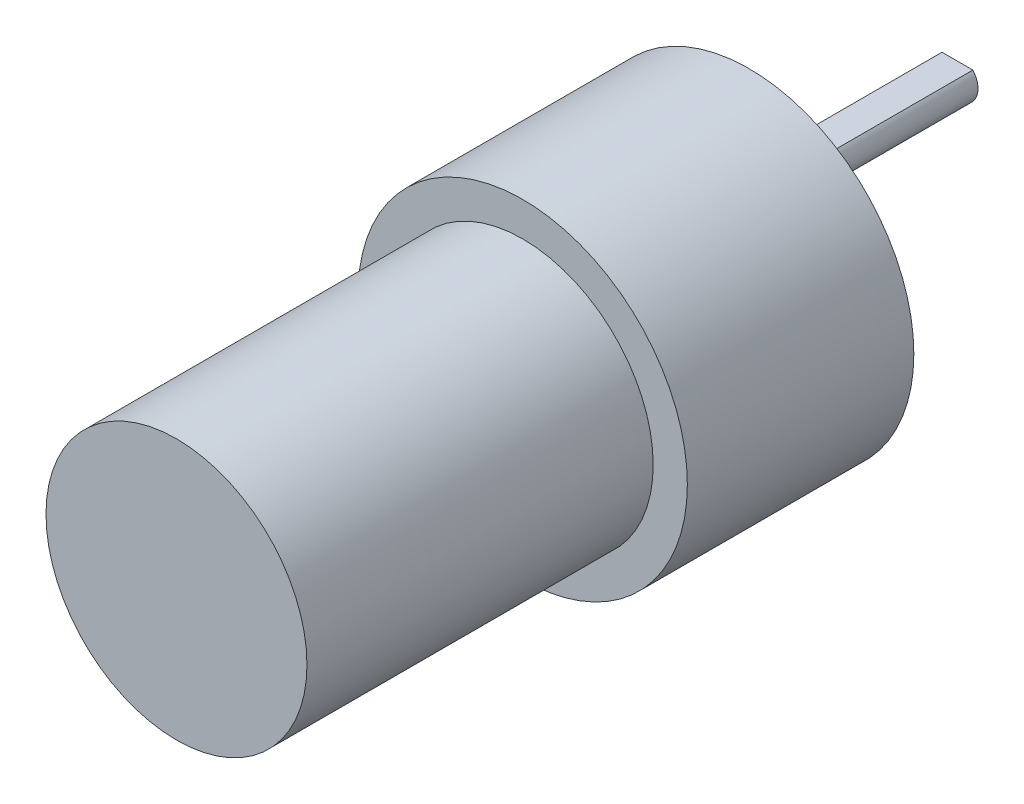
ISO-10303-21;
HEADER;
FILE_DESCRIPTION(('STEP AP214'),'2;1');
FILE_NAME('part.step','',(''),(''),'','','');
FILE_SCHEMA(('AUTOMOTIVE_DESIGN { 1 0 10303 214 1 1 1 1 }'));
ENDSEC;
DATA;
#1=APPLICATION_CONTEXT('core data for automotive mechanical design processes');
#2=APPLICATION_PROTOCOL_DEFINITION('international standard','automotive_design',2000,#1);
#3=PRODUCT_CONTEXT('',#1,'mechanical');
#4=PRODUCT('Part','Part','',(#3));
#5=PRODUCT_RELATED_PRODUCT_CATEGORY('part','',(#4));
#6=PRODUCT_DEFINITION_FORMATION('','',#4);
#7=PRODUCT_DEFINITION_CONTEXT('part definition',#1,'design');
#8=PRODUCT_DEFINITION('design','',#6,#7);
#9=PRODUCT_DEFINITION_SHAPE('','',#8);
#10=(LENGTH_UNIT() NAMED_UNIT(*) SI_UNIT(.MILLI.,.METRE.));
#11=(NAMED_UNIT(*) PLANE_ANGLE_UNIT() SI_UNIT($,.RADIAN.));
#12=(NAMED_UNIT(*) SI_UNIT($,.STERADIAN.) SOLID_ANGLE_UNIT());
#13=UNCERTAINTY_MEASURE_WITH_UNIT(LENGTH_MEASURE(1.E-05),#10,'distance_accuracy_value','');
#14=(GEOMETRIC_REPRESENTATION_CONTEXT(3) GLOBAL_UNCERTAINTY_ASSIGNED_CONTEXT((#13)) GLOBAL_UNIT_ASSIGNED_CONTEXT((#10,
#11,#12)) REPRESENTATION_CONTEXT('',''));
#15=CARTESIAN_POINT('',(0.,0.,0.));
#16=DIRECTION('',(0.,0.,1.));
#17=DIRECTION('',(1.,0.,0.));
#18=AXIS2_PLACEMENT_3D('',#15,#16,#17);
#19=CARTESIAN_POINT('',(0.,0.,0.));
#20=DIRECTION('',(0.,0.,1.));
#21=DIRECTION('',(1.,0.,0.));
#22=AXIS2_PLACEMENT_3D('',#19,#20,#21);
#23=PLANE('',#22);
#24=CARTESIAN_POINT('',(0.,0.,0.));
#25=DIRECTION('',(0.,0.,1.));
#26=DIRECTION('',(1.,0.,0.));
#27=AXIS2_PLACEMENT_3D('',#24,#25,#26);
#28=CIRCLE('',#27,20.0500000000005);
#29=CARTESIAN_POINT('',(20.0500000000005,0.,0.));
#30=VERTEX_POINT('',#29);
#31=EDGE_CURVE('E13',#30,#30,#28,.T.);
#32=ORIENTED_EDGE('',*,*,#31,.T.);
#33=EDGE_LOOP('',(#32));
#34=FACE_BOUND('',#33,.T.);
#35=ADVANCED_FACE('F46',(#34),#23,.T.);
#36=CARTESIAN_POINT('',(0.,0.,0.));
#37=DIRECTION('',(0.,0.,1.));
#38=DIRECTION('',(1.,0.,0.));
#39=AXIS2_PLACEMENT_3D('',#36,#37,#38);
#40=CYLINDRICAL_SURFACE('',#39,20.0500000000003);
#41=CARTESIAN_POINT('',(0.,0.,-53.2));
#42=DIRECTION('',(0.,0.,1.));
#43=DIRECTION('',(1.,0.,0.));
#44=AXIS2_PLACEMENT_3D('',#41,#42,#43);
#45=CIRCLE('',#44,20.05);
#46=CARTESIAN_POINT('',(20.05,0.,-53.2));
#47=VERTEX_POINT('',#46);
#48=EDGE_CURVE('E53',#47,#47,#45,.T.);
#49=ORIENTED_EDGE('',*,*,#48,.T.);
#50=EDGE_LOOP('',(#49));
#51=FACE_BOUND('',#50,.T.);
#52=ORIENTED_EDGE('',*,*,#31,.F.);
#53=EDGE_LOOP('',(#52));
#54=FACE_BOUND('',#53,.T.);
#55=ADVANCED_FACE('F108',(#51,#54),#40,.T.);
#56=CARTESIAN_POINT('',(20.05,0.,-53.2));
#57=DIRECTION('',(0.,0.,1.));
#58=DIRECTION('',(1.,0.,0.));
#59=AXIS2_PLACEMENT_3D('',#56,#57,#58);
#60=PLANE('',#59);
#61=CARTESIAN_POINT('',(0.,0.,-53.2));
#62=DIRECTION('',(0.,0.,1.));
#63=DIRECTION('',(1.,0.,0.));
#64=AXIS2_PLACEMENT_3D('',#61,#62,#63);
#65=CIRCLE('',#64,25.3);
#66=CARTESIAN_POINT('',(25.3,0.,-53.2));
#67=VERTEX_POINT('',#66);
#68=EDGE_CURVE('E103',#67,#67,#65,.T.);
#69=ORIENTED_EDGE('',*,*,#68,.T.);
#70=EDGE_LOOP('',(#69));
#71=FACE_BOUND('',#70,.T.);
#72=ORIENTED_EDGE('',*,*,#48,.F.);
#73=EDGE_LOOP('',(#72));
#74=FACE_BOUND('',#73,.T.);
#75=ADVANCED_FACE('F111',(#71,#74),#60,.T.);
#76=CARTESIAN_POINT('',(0.,0.,0.));
#77=DIRECTION('',(0.,0.,1.));
#78=DIRECTION('',(1.,0.,0.));
#79=AXIS2_PLACEMENT_3D('',#76,#77,#78);
#80=CYLINDRICAL_SURFACE('',#79,25.3);
#81=CARTESIAN_POINT('',(0.,0.,-88.));
#82=DIRECTION('',(0.,0.,1.));
#83=DIRECTION('',(1.,0.,0.));
#84=AXIS2_PLACEMENT_3D('',#81,#82,#83);
#85=CIRCLE('',#84,25.3);
#86=CARTESIAN_POINT('',(25.3,0.,-88.));
#87=VERTEX_POINT('',#86);
#88=EDGE_CURVE('E100',#87,#87,#85,.T.);
#89=ORIENTED_EDGE('',*,*,#88,.T.);
#90=EDGE_LOOP('',(#89));
#91=FACE_BOUND('',#90,.T.);
#92=ORIENTED_EDGE('',*,*,#68,.F.);
#93=EDGE_LOOP('',(#92));
#94=FACE_BOUND('',#93,.T.);
#95=ADVANCED_FACE('F113',(#91,#94),#80,.T.);
#96=CARTESIAN_POINT('',(25.3,0.,-88.));
#97=DIRECTION('',(0.,0.,-1.));
#98=DIRECTION('',(-1.,0.,0.));
#99=AXIS2_PLACEMENT_3D('',#96,#97,#98);
#100=PLANE('',#99);
#101=CARTESIAN_POINT('',(19.,0.,-88.));
#102=DIRECTION('',(0.,0.,-1.));
#103=DIRECTION('',(-1.,0.,0.));
#104=AXIS2_PLACEMENT_3D('',#101,#102,#103);
#105=CIRCLE('',#104,2.375);
#106=CARTESIAN_POINT('',(16.625,0.,-88.));
#107=VERTEX_POINT('',#106);
#108=EDGE_CURVE('E252',#107,#107,#105,.T.);
#109=ORIENTED_EDGE('',*,*,#108,.F.);
#110=EDGE_LOOP('',(#109));
#111=FACE_BOUND('',#110,.T.);
#112=CARTESIAN_POINT('',(-19.,0.,-88.));
#113=DIRECTION('',(0.,0.,-1.));
#114=DIRECTION('',(-1.,0.,0.));
#115=AXIS2_PLACEMENT_3D('',#112,#113,#114);
#116=CIRCLE('',#115,2.375);
#117=CARTESIAN_POINT('',(-21.375,0.,-88.));
#118=VERTEX_POINT('',#117);
#119=EDGE_CURVE('E255',#118,#118,#116,.T.);
#120=ORIENTED_EDGE('',*,*,#119,.F.);
#121=EDGE_LOOP('',(#120));
#122=FACE_BOUND('',#121,.T.);
#123=CARTESIAN_POINT('',(0.,0.,-88.));
#124=DIRECTION('',(0.,0.,1.));
#125=DIRECTION('',(1.,0.,0.));
#126=AXIS2_PLACEMENT_3D('',#123,#124,#125);
#127=CIRCLE('',#126,14.25);
#128=CARTESIAN_POINT('',(14.25,0.,-88.));
#129=VERTEX_POINT('',#128);
#130=EDGE_CURVE('E91',#129,#129,#127,.T.);
#131=ORIENTED_EDGE('',*,*,#130,.T.);
#132=EDGE_LOOP('',(#131));
#133=FACE_BOUND('',#132,.T.);
#134=ORIENTED_EDGE('',*,*,#88,.F.);
#135=EDGE_LOOP('',(#134));
#136=FACE_BOUND('',#135,.T.);
#137=ADVANCED_FACE('F120',(#111,#122,#133,#136),#100,.T.);
#138=CARTESIAN_POINT('',(0.,0.,0.));
#139=DIRECTION('',(0.,0.,1.));
#140=DIRECTION('',(1.,0.,0.));
#141=AXIS2_PLACEMENT_3D('',#138,#139,#140);
#142=CYLINDRICAL_SURFACE('',#141,14.25);
#143=CARTESIAN_POINT('',(0.,0.,-89.5));
#144=DIRECTION('',(0.,0.,1.));
#145=DIRECTION('',(1.,0.,0.));
#146=AXIS2_PLACEMENT_3D('',#143,#144,#145);
#147=CIRCLE('',#146,14.25);
#148=CARTESIAN_POINT('',(14.25,0.,-89.5));
#149=VERTEX_POINT('',#148);
#150=EDGE_CURVE('E87',#149,#149,#147,.T.);
#151=ORIENTED_EDGE('',*,*,#150,.T.);
#152=EDGE_LOOP('',(#151));
#153=FACE_BOUND('',#152,.T.);
#154=ORIENTED_EDGE('',*,*,#130,.F.);
#155=EDGE_LOOP('',(#154));
#156=FACE_BOUND('',#155,.T.);
#157=ADVANCED_FACE('F154',(#153,#156),#142,.T.);
#158=CARTESIAN_POINT('',(14.25,0.,-89.5));
#159=DIRECTION('',(0.,0.,-1.));
#160=DIRECTION('',(-1.,0.,0.));
#161=AXIS2_PLACEMENT_3D('',#158,#159,#160);
#162=PLANE('',#161);
#163=CARTESIAN_POINT('',(0.,8.21,-89.5));
#164=DIRECTION('',(0.,0.,-1.));
#165=DIRECTION('',(-1.,0.,0.));
#166=AXIS2_PLACEMENT_3D('',#163,#164,#165);
#167=CIRCLE('',#166,3.16);
#168=CARTESIAN_POINT('',(-3.16,8.21,-89.5));
#169=VERTEX_POINT('',#168);
#170=EDGE_CURVE('E88',#169,#169,#167,.T.);
#171=ORIENTED_EDGE('',*,*,#170,.F.);
#172=EDGE_LOOP('',(#171));
#173=FACE_BOUND('',#172,.T.);
#174=ORIENTED_EDGE('',*,*,#150,.F.);
#175=EDGE_LOOP('',(#174));
#176=FACE_BOUND('',#175,.T.);
#177=ADVANCED_FACE('F165',(#173,#176),#162,.T.);
#178=CARTESIAN_POINT('',(0.,8.21,-120.));
#179=DIRECTION('',(0.,0.,1.));
#180=DIRECTION('',(1.,0.,0.));
#181=AXIS2_PLACEMENT_3D('',#178,#179,#180);
#182=CYLINDRICAL_SURFACE('',#181,3.16);
#183=CARTESIAN_POINT('',(0.,8.21,-120.));
#184=DIRECTION('',(0.,0.,-1.));
#185=DIRECTION('',(-1.,0.,0.));
#186=AXIS2_PLACEMENT_3D('',#183,#184,#185);
#187=CIRCLE('',#186,3.16);
#188=CARTESIAN_POINT('',(2.37012657889827,10.3,-120.));
#189=VERTEX_POINT('',#188);
#190=CARTESIAN_POINT('',(-2.37012657889827,10.3,-120.));
#191=VERTEX_POINT('',#190);
#192=EDGE_CURVE('E83',#189,#191,#187,.T.);
#193=ORIENTED_EDGE('',*,*,#192,.F.);
#194=DIRECTION('',(0.,0.,-1.));
#195=VECTOR('',#194,1.);
#196=CARTESIAN_POINT('',(2.37012657889827,10.3,-84.6404835631516));
#197=LINE('',#196,#195);
#198=CARTESIAN_POINT('',(2.37012657889827,10.3,-91.));
#199=VERTEX_POINT('',#198);
#200=EDGE_CURVE('E60',#199,#189,#197,.T.);
#201=ORIENTED_EDGE('',*,*,#200,.F.);
#202=CARTESIAN_POINT('',(0.,8.21,-91.));
#203=DIRECTION('',(0.,0.,-1.));
#204=DIRECTION('',(-1.,0.,0.));
#205=AXIS2_PLACEMENT_3D('',#202,#203,#204);
#206=CIRCLE('',#205,3.16);
#207=CARTESIAN_POINT('',(-2.37012657889827,10.3,-91.));
#208=VERTEX_POINT('',#207);
#209=EDGE_CURVE('E84',#199,#208,#206,.F.);
#210=ORIENTED_EDGE('',*,*,#209,.T.);
#211=DIRECTION('',(0.,0.,-1.));
#212=VECTOR('',#211,1.);
#213=CARTESIAN_POINT('',(-2.37012657889827,10.3,-84.6404835631516));
#214=LINE('',#213,#212);
#215=EDGE_CURVE('E73',#208,#191,#214,.T.);
#216=ORIENTED_EDGE('',*,*,#215,.T.);
#217=EDGE_LOOP('',(#193,#201,#210,#216));
#218=FACE_BOUND('',#217,.T.);
#219=ORIENTED_EDGE('',*,*,#170,.T.);
#220=EDGE_LOOP('',(#219));
#221=FACE_BOUND('',#220,.T.);
#222=ADVANCED_FACE('F81',(#218,#221),#182,.T.);
#223=CARTESIAN_POINT('',(0.,8.21,-120.));
#224=DIRECTION('',(0.,0.,-1.));
#225=DIRECTION('',(-1.,0.,0.));
#226=AXIS2_PLACEMENT_3D('',#223,#224,#225);
#227=PLANE('',#226);
#228=DIRECTION('',(-1.,0.,0.));
#229=VECTOR('',#228,1.);
#230=CARTESIAN_POINT('',(2.37012657889827,10.3,-120.));
#231=LINE('',#230,#229);
#232=EDGE_CURVE('E70',#189,#191,#231,.T.);
#233=ORIENTED_EDGE('',*,*,#232,.F.);
#234=ORIENTED_EDGE('',*,*,#192,.T.);
#235=EDGE_LOOP('',(#233,#234));
#236=FACE_BOUND('',#235,.T.);
#237=ADVANCED_FACE('F86',(#236),#227,.T.);
#238=CARTESIAN_POINT('',(2.37012657889827,10.3,-84.6404835631516));
#239=DIRECTION('',(0.,-1.,0.));
#240=DIRECTION('',(0.,0.,-1.));
#241=AXIS2_PLACEMENT_3D('',#238,#239,#240);
#242=PLANE('',#241);
#243=DIRECTION('',(1.,0.,0.));
#244=VECTOR('',#243,1.);
#245=CARTESIAN_POINT('',(2.37012657889827,10.3,-91.));
#246=LINE('',#245,#244);
#247=EDGE_CURVE('E65',#208,#199,#246,.T.);
#248=ORIENTED_EDGE('',*,*,#247,.T.);
#249=ORIENTED_EDGE('',*,*,#200,.T.);
#250=ORIENTED_EDGE('',*,*,#232,.T.);
#251=ORIENTED_EDGE('',*,*,#215,.F.);
#252=EDGE_LOOP('',(#248,#249,#250,#251));
#253=FACE_BOUND('',#252,.T.);
#254=ADVANCED_FACE('F72',(#253),#242,.F.);
#255=CARTESIAN_POINT('',(14.25,0.,-91.));
#256=DIRECTION('',(0.,0.,-1.));
#257=DIRECTION('',(-1.,0.,0.));
#258=AXIS2_PLACEMENT_3D('',#255,#256,#257);
#259=PLANE('',#258);
#260=ORIENTED_EDGE('',*,*,#209,.F.);
#261=ORIENTED_EDGE('',*,*,#247,.F.);
#262=EDGE_LOOP('',(#260,#261));
#263=FACE_BOUND('',#262,.T.);
#264=ADVANCED_FACE('F200',(#263),#259,.T.);
#265=CARTESIAN_POINT('',(-19.,0.,-83.));
#266=DIRECTION('',(0.,0.,-1.));
#267=DIRECTION('',(-1.,0.,0.));
#268=AXIS2_PLACEMENT_3D('',#265,#266,#267);
#269=CYLINDRICAL_SURFACE('',#268,2.375);
#270=CARTESIAN_POINT('',(-19.,0.,-83.));
#271=DIRECTION('',(0.,0.,-1.));
#272=DIRECTION('',(-1.,0.,0.));
#273=AXIS2_PLACEMENT_3D('',#270,#271,#272);
#274=CIRCLE('',#273,2.375);
#275=CARTESIAN_POINT('',(-21.375,0.,-83.));
#276=VERTEX_POINT('',#275);
#277=EDGE_CURVE('E260',#276,#276,#274,.T.);
#278=ORIENTED_EDGE('',*,*,#277,.F.);
#279=EDGE_LOOP('',(#278));
#280=FACE_BOUND('',#279,.T.);
#281=ORIENTED_EDGE('',*,*,#119,.T.);
#282=EDGE_LOOP('',(#281));
#283=FACE_BOUND('',#282,.T.);
#284=ADVANCED_FACE('F208',(#280,#283),#269,.F.);
#285=CARTESIAN_POINT('',(-19.,0.,-83.));
#286=DIRECTION('',(0.,0.,-1.));
#287=DIRECTION('',(-1.,0.,0.));
#288=AXIS2_PLACEMENT_3D('',#285,#286,#287);
#289=PLANE('',#288);
#290=ORIENTED_EDGE('',*,*,#277,.T.);
#291=EDGE_LOOP('',(#290));
#292=FACE_BOUND('',#291,.T.);
#293=ADVANCED_FACE('F217',(#292),#289,.T.);
#294=CARTESIAN_POINT('',(19.,0.,-83.));
#295=DIRECTION('',(0.,0.,-1.));
#296=DIRECTION('',(-1.,0.,0.));
#297=AXIS2_PLACEMENT_3D('',#294,#295,#296);
#298=CYLINDRICAL_SURFACE('',#297,2.375);
#299=CARTESIAN_POINT('',(19.,0.,-83.));
#300=DIRECTION('',(0.,0.,-1.));
#301=DIRECTION('',(-1.,0.,0.));
#302=AXIS2_PLACEMENT_3D('',#299,#300,#301);
#303=CIRCLE('',#302,2.375);
#304=CARTESIAN_POINT('',(16.625,0.,-83.));
#305=VERTEX_POINT('',#304);
#306=EDGE_CURVE('E77',#305,#305,#303,.T.);
#307=ORIENTED_EDGE('',*,*,#306,.F.);
#308=EDGE_LOOP('',(#307));
#309=FACE_BOUND('',#308,.T.);
#310=ORIENTED_EDGE('',*,*,#108,.T.);
#311=EDGE_LOOP('',(#310));
#312=FACE_BOUND('',#311,.T.);
#313=ADVANCED_FACE('F227',(#309,#312),#298,.F.);
#314=CARTESIAN_POINT('',(19.,0.,-83.));
#315=DIRECTION('',(0.,0.,-1.));
#316=DIRECTION('',(-1.,0.,0.));
#317=AXIS2_PLACEMENT_3D('',#314,#315,#316);
#318=PLANE('',#317);
#319=ORIENTED_EDGE('',*,*,#306,.T.);
#320=EDGE_LOOP('',(#319));
#321=FACE_BOUND('',#320,.T.);
#322=ADVANCED_FACE('F237',(#321),#318,.T.);
#323=CLOSED_SHELL('',(#35,#55,#75,#95,#137,#157,#177,#222,#237,#254,#264,#284,#293,#313,#322));
#324=MANIFOLD_SOLID_BREP('B2',#323);
#325=ADVANCED_BREP_SHAPE_REPRESENTATION('',(#18,#324),#14);
#326=SHAPE_DEFINITION_REPRESENTATION(#9,#325);
ENDSEC;
END-ISO-10303-21;
